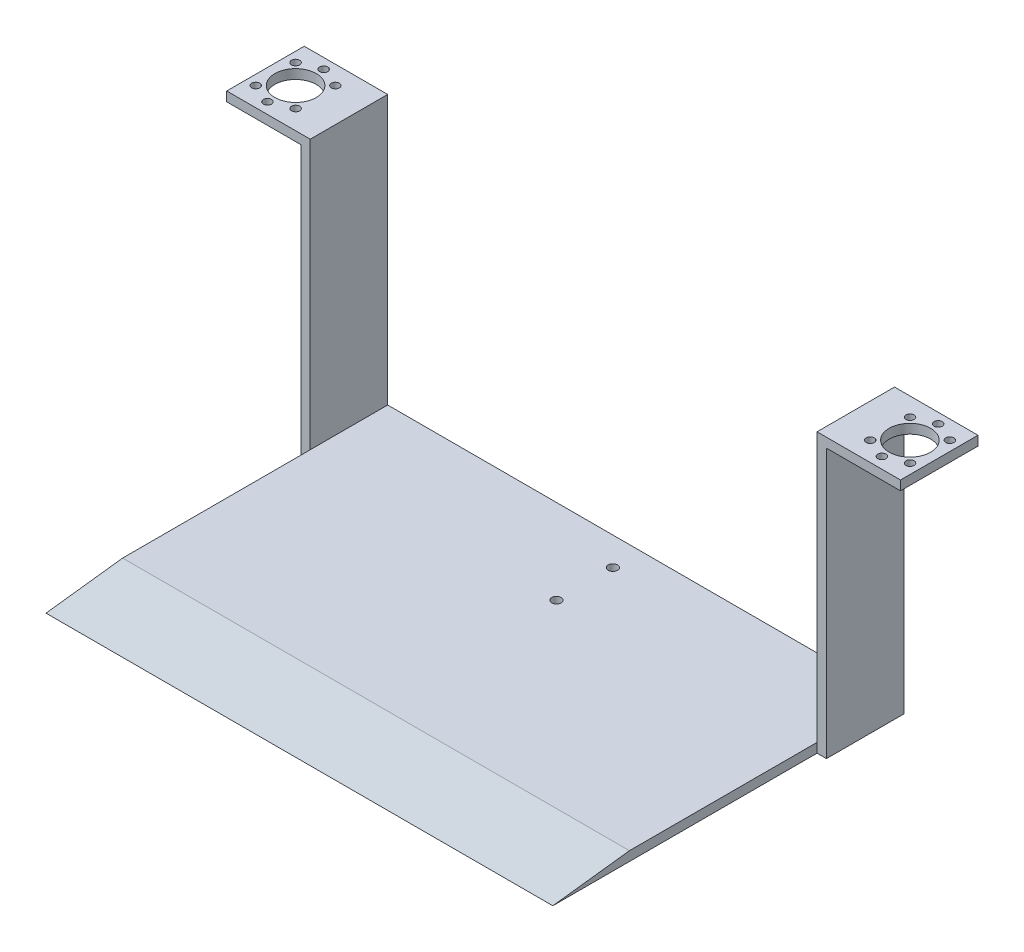
ISO-10303-21;
HEADER;
FILE_DESCRIPTION(('STEP AP214'),'2;1');
FILE_NAME('part.step','',(''),(''),'','','');
FILE_SCHEMA(('AUTOMOTIVE_DESIGN { 1 0 10303 214 1 1 1 1 }'));
ENDSEC;
DATA;
#1=APPLICATION_CONTEXT('core data for automotive mechanical design processes');
#2=APPLICATION_PROTOCOL_DEFINITION('international standard','automotive_design',2000,#1);
#3=PRODUCT_CONTEXT('',#1,'mechanical');
#4=PRODUCT('Part','Part','',(#3));
#5=PRODUCT_RELATED_PRODUCT_CATEGORY('part','',(#4));
#6=PRODUCT_DEFINITION_FORMATION('','',#4);
#7=PRODUCT_DEFINITION_CONTEXT('part definition',#1,'design');
#8=PRODUCT_DEFINITION('design','',#6,#7);
#9=PRODUCT_DEFINITION_SHAPE('','',#8);
#10=(LENGTH_UNIT() NAMED_UNIT(*) SI_UNIT(.MILLI.,.METRE.));
#11=(NAMED_UNIT(*) PLANE_ANGLE_UNIT() SI_UNIT($,.RADIAN.));
#12=(NAMED_UNIT(*) SI_UNIT($,.STERADIAN.) SOLID_ANGLE_UNIT());
#13=UNCERTAINTY_MEASURE_WITH_UNIT(LENGTH_MEASURE(1.E-05),#10,'distance_accuracy_value','');
#14=(GEOMETRIC_REPRESENTATION_CONTEXT(3) GLOBAL_UNCERTAINTY_ASSIGNED_CONTEXT((#13)) GLOBAL_UNIT_ASSIGNED_CONTEXT((#10,
#11,#12)) REPRESENTATION_CONTEXT('',''));
#15=CARTESIAN_POINT('',(0.,0.,0.));
#16=DIRECTION('',(0.,0.,1.));
#17=DIRECTION('',(1.,0.,0.));
#18=AXIS2_PLACEMENT_3D('',#15,#16,#17);
#19=CARTESIAN_POINT('',(0.,187.96,0.));
#20=DIRECTION('',(0.,-1.,0.));
#21=DIRECTION('',(0.,0.,-1.));
#22=AXIS2_PLACEMENT_3D('',#19,#20,#21);
#23=PLANE('',#22);
#24=CARTESIAN_POINT('',(20.0659999999999,187.96,-374.092));
#25=DIRECTION('',(0.,1.,0.));
#26=DIRECTION('',(0.,0.,1.));
#27=AXIS2_PLACEMENT_3D('',#24,#25,#26);
#28=CIRCLE('',#27,2.75);
#29=CARTESIAN_POINT('',(20.0659999999999,187.96,-371.342));
#30=VERTEX_POINT('',#29);
#31=EDGE_CURVE('E231',#30,#30,#28,.T.);
#32=ORIENTED_EDGE('',*,*,#31,.F.);
#33=EDGE_LOOP('',(#32));
#34=FACE_BOUND('',#33,.T.);
#35=CARTESIAN_POINT('',(6.63097115745544,187.96,-341.656971157456));
#36=DIRECTION('',(0.,1.,0.));
#37=DIRECTION('',(0.,0.,1.));
#38=AXIS2_PLACEMENT_3D('',#35,#36,#37);
#39=CIRCLE('',#38,2.75);
#40=CARTESIAN_POINT('',(6.63097115745544,187.96,-338.906971157456));
#41=VERTEX_POINT('',#40);
#42=EDGE_CURVE('E228',#41,#41,#39,.T.);
#43=ORIENTED_EDGE('',*,*,#42,.F.);
#44=EDGE_LOOP('',(#43));
#45=FACE_BOUND('',#44,.T.);
#46=CARTESIAN_POINT('',(20.0659999999999,187.96,-336.092));
#47=DIRECTION('',(0.,1.,0.));
#48=DIRECTION('',(0.,0.,1.));
#49=AXIS2_PLACEMENT_3D('',#46,#47,#48);
#50=CIRCLE('',#49,2.75);
#51=CARTESIAN_POINT('',(20.0659999999999,187.96,-333.342));
#52=VERTEX_POINT('',#51);
#53=EDGE_CURVE('E240',#52,#52,#50,.T.);
#54=ORIENTED_EDGE('',*,*,#53,.F.);
#55=EDGE_LOOP('',(#54));
#56=FACE_BOUND('',#55,.T.);
#57=CARTESIAN_POINT('',(33.5010288425443,187.96,-341.656971157456));
#58=DIRECTION('',(0.,1.,0.));
#59=DIRECTION('',(0.,0.,1.));
#60=AXIS2_PLACEMENT_3D('',#57,#58,#59);
#61=CIRCLE('',#60,2.75);
#62=CARTESIAN_POINT('',(33.5010288425443,187.96,-338.906971157456));
#63=VERTEX_POINT('',#62);
#64=EDGE_CURVE('E248',#63,#63,#61,.T.);
#65=ORIENTED_EDGE('',*,*,#64,.F.);
#66=EDGE_LOOP('',(#65));
#67=FACE_BOUND('',#66,.T.);
#68=CARTESIAN_POINT('',(33.5010288425443,187.96,-368.527028842544));
#69=DIRECTION('',(0.,1.,0.));
#70=DIRECTION('',(0.,0.,1.));
#71=AXIS2_PLACEMENT_3D('',#68,#69,#70);
#72=CIRCLE('',#71,2.75);
#73=CARTESIAN_POINT('',(33.5010288425443,187.96,-365.777028842544));
#74=VERTEX_POINT('',#73);
#75=EDGE_CURVE('E244',#74,#74,#72,.T.);
#76=ORIENTED_EDGE('',*,*,#75,.F.);
#77=EDGE_LOOP('',(#76));
#78=FACE_BOUND('',#77,.T.);
#79=CARTESIAN_POINT('',(6.63097115745544,187.96,-368.527028842544));
#80=DIRECTION('',(0.,1.,0.));
#81=DIRECTION('',(0.,0.,1.));
#82=AXIS2_PLACEMENT_3D('',#79,#80,#81);
#83=CIRCLE('',#82,2.75);
#84=CARTESIAN_POINT('',(6.63097115745544,187.96,-365.777028842544));
#85=VERTEX_POINT('',#84);
#86=EDGE_CURVE('E236',#85,#85,#83,.T.);
#87=ORIENTED_EDGE('',*,*,#86,.F.);
#88=EDGE_LOOP('',(#87));
#89=FACE_BOUND('',#88,.T.);
#90=CARTESIAN_POINT('',(20.0659999999999,187.96,-355.092));
#91=DIRECTION('',(0.,1.,0.));
#92=DIRECTION('',(0.,0.,1.));
#93=AXIS2_PLACEMENT_3D('',#90,#91,#92);
#94=CIRCLE('',#93,14.);
#95=CARTESIAN_POINT('',(20.0659999999999,187.96,-341.092));
#96=VERTEX_POINT('',#95);
#97=EDGE_CURVE('E345',#96,#96,#94,.T.);
#98=ORIENTED_EDGE('',*,*,#97,.F.);
#99=EDGE_LOOP('',(#98));
#100=FACE_BOUND('',#99,.T.);
#101=DIRECTION('',(0.,0.,1.));
#102=VECTOR('',#101,1.);
#103=CARTESIAN_POINT('',(0.,187.96,0.));
#104=LINE('',#103,#102);
#105=CARTESIAN_POINT('',(-1.11022302462516E-13,187.96,-381.));
#106=VERTEX_POINT('',#105);
#107=CARTESIAN_POINT('',(-1.11022302462516E-13,187.96,-328.676));
#108=VERTEX_POINT('',#107);
#109=EDGE_CURVE('E358',#106,#108,#104,.T.);
#110=ORIENTED_EDGE('',*,*,#109,.T.);
#111=DIRECTION('',(-1.,0.,0.));
#112=VECTOR('',#111,1.);
#113=CARTESIAN_POINT('',(56.3626,187.96,-328.676));
#114=LINE('',#113,#112);
#115=CARTESIAN_POINT('',(56.3626,187.96,-328.676));
#116=VERTEX_POINT('',#115);
#117=EDGE_CURVE('E192',#116,#108,#114,.T.);
#118=ORIENTED_EDGE('',*,*,#117,.F.);
#119=DIRECTION('',(0.,0.,1.));
#120=VECTOR('',#119,1.);
#121=CARTESIAN_POINT('',(56.3626,187.96,-381.));
#122=LINE('',#121,#120);
#123=CARTESIAN_POINT('',(56.3626,187.96,-381.));
#124=VERTEX_POINT('',#123);
#125=EDGE_CURVE('E331',#124,#116,#122,.T.);
#126=ORIENTED_EDGE('',*,*,#125,.F.);
#127=DIRECTION('',(-1.,0.,0.));
#128=VECTOR('',#127,1.);
#129=CARTESIAN_POINT('',(-1.11022302462516E-13,187.96,-381.));
#130=LINE('',#129,#128);
#131=EDGE_CURVE('E62',#124,#106,#130,.T.);
#132=ORIENTED_EDGE('',*,*,#131,.T.);
#133=EDGE_LOOP('',(#110,#118,#126,#132));
#134=FACE_BOUND('',#133,.T.);
#135=ADVANCED_FACE('F44',(#34,#45,#56,#67,#78,#89,#100,#134),#23,.F.);
#136=CARTESIAN_POINT('',(0.,187.96,0.));
#137=DIRECTION('',(1.,0.,0.));
#138=DIRECTION('',(0.,0.,-1.));
#139=AXIS2_PLACEMENT_3D('',#136,#137,#138);
#140=PLANE('',#139);
#141=DIRECTION('',(0.,0.,-1.));
#142=VECTOR('',#141,1.);
#143=CARTESIAN_POINT('',(-1.66533453693774E-13,181.597400076,-381.));
#144=LINE('',#143,#142);
#145=CARTESIAN_POINT('',(-1.11022302462516E-13,181.597400076,-328.676));
#146=VERTEX_POINT('',#145);
#147=CARTESIAN_POINT('',(-1.66533453693774E-13,181.597400076,-381.));
#148=VERTEX_POINT('',#147);
#149=EDGE_CURVE('E285',#146,#148,#144,.T.);
#150=ORIENTED_EDGE('',*,*,#149,.F.);
#151=DIRECTION('',(0.,1.,0.));
#152=VECTOR('',#151,1.);
#153=CARTESIAN_POINT('',(-1.11022302462516E-13,0.,-328.676));
#154=LINE('',#153,#152);
#155=EDGE_CURVE('E204',#146,#108,#154,.T.);
#156=ORIENTED_EDGE('',*,*,#155,.T.);
#157=ORIENTED_EDGE('',*,*,#109,.F.);
#158=DIRECTION('',(0.,-1.,0.));
#159=VECTOR('',#158,1.);
#160=CARTESIAN_POINT('',(-1.11022302462516E-13,187.96,-381.));
#161=LINE('',#160,#159);
#162=EDGE_CURVE('E366',#106,#148,#161,.T.);
#163=ORIENTED_EDGE('',*,*,#162,.T.);
#164=EDGE_LOOP('',(#150,#156,#157,#163));
#165=FACE_BOUND('',#164,.T.);
#166=ADVANCED_FACE('F46',(#165),#140,.F.);
#167=CARTESIAN_POINT('',(454.914,187.96,0.));
#168=DIRECTION('',(-1.,0.,0.));
#169=DIRECTION('',(0.,0.,1.));
#170=AXIS2_PLACEMENT_3D('',#167,#168,#169);
#171=PLANE('',#170);
#172=DIRECTION('',(0.,0.,-1.));
#173=VECTOR('',#172,1.);
#174=CARTESIAN_POINT('',(454.914,187.96,0.));
#175=LINE('',#174,#173);
#176=CARTESIAN_POINT('',(454.914,187.96,-328.676));
#177=VERTEX_POINT('',#176);
#178=CARTESIAN_POINT('',(454.914,187.96,-381.));
#179=VERTEX_POINT('',#178);
#180=EDGE_CURVE('E70',#177,#179,#175,.T.);
#181=ORIENTED_EDGE('',*,*,#180,.F.);
#182=DIRECTION('',(0.,1.,0.));
#183=VECTOR('',#182,1.);
#184=CARTESIAN_POINT('',(454.914,0.,-328.676));
#185=LINE('',#184,#183);
#186=CARTESIAN_POINT('',(454.914,181.597400076,-328.676));
#187=VERTEX_POINT('',#186);
#188=EDGE_CURVE('E186',#187,#177,#185,.T.);
#189=ORIENTED_EDGE('',*,*,#188,.F.);
#190=DIRECTION('',(0.,0.,1.));
#191=VECTOR('',#190,1.);
#192=CARTESIAN_POINT('',(454.914,181.597400076,-202.0062));
#193=LINE('',#192,#191);
#194=CARTESIAN_POINT('',(454.914,181.597400076,-381.));
#195=VERTEX_POINT('',#194);
#196=EDGE_CURVE('E305',#195,#187,#193,.T.);
#197=ORIENTED_EDGE('',*,*,#196,.F.);
#198=DIRECTION('',(0.,-1.,0.));
#199=VECTOR('',#198,1.);
#200=CARTESIAN_POINT('',(454.914,187.96,-381.));
#201=LINE('',#200,#199);
#202=EDGE_CURVE('E373',#179,#195,#201,.T.);
#203=ORIENTED_EDGE('',*,*,#202,.F.);
#204=EDGE_LOOP('',(#181,#189,#197,#203));
#205=FACE_BOUND('',#204,.T.);
#206=ADVANCED_FACE('F471',(#205),#171,.F.);
#207=CARTESIAN_POINT('',(-1.11022302462516E-13,187.96,-381.));
#208=DIRECTION('',(0.,0.,1.));
#209=DIRECTION('',(1.,0.,0.));
#210=AXIS2_PLACEMENT_3D('',#207,#208,#209);
#211=PLANE('',#210);
#212=DIRECTION('',(0.,-1.,0.));
#213=VECTOR('',#212,1.);
#214=CARTESIAN_POINT('',(50.0125999999998,0.,-381.));
#215=LINE('',#214,#213);
#216=CARTESIAN_POINT('',(50.0125999999998,181.597400076,-381.));
#217=VERTEX_POINT('',#216);
#218=CARTESIAN_POINT('',(50.0125999999998,0.,-381.));
#219=VERTEX_POINT('',#218);
#220=EDGE_CURVE('E287',#217,#219,#215,.T.);
#221=ORIENTED_EDGE('',*,*,#220,.F.);
#222=DIRECTION('',(-1.,0.,0.));
#223=VECTOR('',#222,1.);
#224=CARTESIAN_POINT('',(50.0125999999998,181.597400076,-381.));
#225=LINE('',#224,#223);
#226=EDGE_CURVE('E294',#217,#148,#225,.T.);
#227=ORIENTED_EDGE('',*,*,#226,.T.);
#228=ORIENTED_EDGE('',*,*,#162,.F.);
#229=ORIENTED_EDGE('',*,*,#131,.F.);
#230=DIRECTION('',(0.,1.,0.));
#231=VECTOR('',#230,1.);
#232=CARTESIAN_POINT('',(56.3626,6.35000000000002,-381.));
#233=LINE('',#232,#231);
#234=CARTESIAN_POINT('',(56.3626,6.35000000000002,-381.));
#235=VERTEX_POINT('',#234);
#236=EDGE_CURVE('E338',#235,#124,#233,.T.);
#237=ORIENTED_EDGE('',*,*,#236,.F.);
#238=DIRECTION('',(-1.,0.,0.));
#239=VECTOR('',#238,1.);
#240=CARTESIAN_POINT('',(56.3626,6.35000000000002,-381.));
#241=LINE('',#240,#239);
#242=CARTESIAN_POINT('',(398.5514,6.35000000000002,-381.));
#243=VERTEX_POINT('',#242);
#244=EDGE_CURVE('E326',#243,#235,#241,.T.);
#245=ORIENTED_EDGE('',*,*,#244,.F.);
#246=DIRECTION('',(0.,1.,0.));
#247=VECTOR('',#246,1.);
#248=CARTESIAN_POINT('',(398.5514,6.35000000000002,-381.));
#249=LINE('',#248,#247);
#250=CARTESIAN_POINT('',(398.5514,187.96,-381.));
#251=VERTEX_POINT('',#250);
#252=EDGE_CURVE('E330',#243,#251,#249,.T.);
#253=ORIENTED_EDGE('',*,*,#252,.T.);
#254=EDGE_CURVE('E363',#179,#251,#130,.T.);
#255=ORIENTED_EDGE('',*,*,#254,.F.);
#256=ORIENTED_EDGE('',*,*,#202,.T.);
#257=DIRECTION('',(1.,0.,0.));
#258=VECTOR('',#257,1.);
#259=CARTESIAN_POINT('',(404.9014,181.597400076,-381.));
#260=LINE('',#259,#258);
#261=CARTESIAN_POINT('',(404.9014,181.597400076,-381.));
#262=VERTEX_POINT('',#261);
#263=EDGE_CURVE('E309',#262,#195,#260,.T.);
#264=ORIENTED_EDGE('',*,*,#263,.F.);
#265=DIRECTION('',(0.,1.,0.));
#266=VECTOR('',#265,1.);
#267=CARTESIAN_POINT('',(404.9014,0.,-381.));
#268=LINE('',#267,#266);
#269=CARTESIAN_POINT('',(404.9014,0.,-381.));
#270=VERTEX_POINT('',#269);
#271=EDGE_CURVE('E301',#270,#262,#268,.T.);
#272=ORIENTED_EDGE('',*,*,#271,.F.);
#273=DIRECTION('',(-1.,0.,0.));
#274=VECTOR('',#273,1.);
#275=CARTESIAN_POINT('',(-1.11022302462516E-13,0.,-381.));
#276=LINE('',#275,#274);
#277=EDGE_CURVE('E355',#270,#219,#276,.T.);
#278=ORIENTED_EDGE('',*,*,#277,.T.);
#279=EDGE_LOOP('',(#221,#227,#228,#229,#237,#245,#253,#255,#256,#264,#272,#278));
#280=FACE_BOUND('',#279,.T.);
#281=ADVANCED_FACE('F461',(#280),#211,.F.);
#282=CARTESIAN_POINT('',(434.848,187.96,-374.174211984588));
#283=DIRECTION('',(0.,1.,0.));
#284=DIRECTION('',(0.,0.,1.));
#285=AXIS2_PLACEMENT_3D('',#282,#283,#284);
#286=CIRCLE('',#285,2.7499945);
#287=CARTESIAN_POINT('',(434.848,187.96,-371.424217484588));
#288=VERTEX_POINT('',#287);
#289=EDGE_CURVE('E255',#288,#288,#286,.T.);
#290=ORIENTED_EDGE('',*,*,#289,.F.);
#291=EDGE_LOOP('',(#290));
#292=FACE_BOUND('',#291,.T.);
#293=CARTESIAN_POINT('',(421.412971157455,187.96,-341.739183142044));
#294=DIRECTION('',(0.,1.,0.));
#295=DIRECTION('',(0.,0.,1.));
#296=AXIS2_PLACEMENT_3D('',#293,#294,#295);
#297=CIRCLE('',#296,2.74999999999998);
#298=CARTESIAN_POINT('',(421.412971157455,187.96,-338.989183142044));
#299=VERTEX_POINT('',#298);
#300=EDGE_CURVE('E261',#299,#299,#297,.T.);
#301=ORIENTED_EDGE('',*,*,#300,.F.);
#302=EDGE_LOOP('',(#301));
#303=FACE_BOUND('',#302,.T.);
#304=CARTESIAN_POINT('',(434.848,187.96,-336.174211984588));
#305=DIRECTION('',(0.,1.,0.));
#306=DIRECTION('',(0.,0.,1.));
#307=AXIS2_PLACEMENT_3D('',#304,#305,#306);
#308=CIRCLE('',#307,2.74999999999998);
#309=CARTESIAN_POINT('',(434.848,187.96,-333.424211984588));
#310=VERTEX_POINT('',#309);
#311=EDGE_CURVE('E265',#310,#310,#308,.T.);
#312=ORIENTED_EDGE('',*,*,#311,.F.);
#313=EDGE_LOOP('',(#312));
#314=FACE_BOUND('',#313,.T.);
#315=CARTESIAN_POINT('',(448.283028842544,187.96,-341.739183142044));
#316=DIRECTION('',(0.,1.,0.));
#317=DIRECTION('',(0.,0.,1.));
#318=AXIS2_PLACEMENT_3D('',#315,#316,#317);
#319=CIRCLE('',#318,2.74999999999991);
#320=CARTESIAN_POINT('',(448.283028842544,187.96,-338.989183142044));
#321=VERTEX_POINT('',#320);
#322=EDGE_CURVE('E274',#321,#321,#319,.T.);
#323=ORIENTED_EDGE('',*,*,#322,.F.);
#324=EDGE_LOOP('',(#323));
#325=FACE_BOUND('',#324,.T.);
#326=CARTESIAN_POINT('',(421.412971157455,187.96,-368.609240827133));
#327=DIRECTION('',(0.,1.,0.));
#328=DIRECTION('',(0.,0.,1.));
#329=AXIS2_PLACEMENT_3D('',#326,#327,#328);
#330=CIRCLE('',#329,2.74999999999998);
#331=CARTESIAN_POINT('',(421.412971157455,187.96,-365.859240827133));
#332=VERTEX_POINT('',#331);
#333=EDGE_CURVE('E270',#332,#332,#330,.T.);
#334=ORIENTED_EDGE('',*,*,#333,.F.);
#335=EDGE_LOOP('',(#334));
#336=FACE_BOUND('',#335,.T.);
#337=CARTESIAN_POINT('',(448.283028842544,187.96,-368.609240827133));
#338=DIRECTION('',(0.,1.,0.));
#339=DIRECTION('',(0.,0.,1.));
#340=AXIS2_PLACEMENT_3D('',#337,#338,#339);
#341=CIRCLE('',#340,2.74999999999998);
#342=CARTESIAN_POINT('',(448.283028842544,187.96,-365.859240827133));
#343=VERTEX_POINT('',#342);
#344=EDGE_CURVE('E260',#343,#343,#341,.T.);
#345=ORIENTED_EDGE('',*,*,#344,.F.);
#346=EDGE_LOOP('',(#345));
#347=FACE_BOUND('',#346,.T.);
#348=CARTESIAN_POINT('',(434.848,187.96,-355.092));
#349=DIRECTION('',(0.,1.,0.));
#350=DIRECTION('',(0.,0.,1.));
#351=AXIS2_PLACEMENT_3D('',#348,#349,#350);
#352=CIRCLE('',#351,14.);
#353=CARTESIAN_POINT('',(434.848,187.96,-341.092));
#354=VERTEX_POINT('',#353);
#355=EDGE_CURVE('E341',#354,#354,#352,.T.);
#356=ORIENTED_EDGE('',*,*,#355,.F.);
#357=EDGE_LOOP('',(#356));
#358=FACE_BOUND('',#357,.T.);
#359=DIRECTION('',(0.,0.,-1.));
#360=VECTOR('',#359,1.);
#361=CARTESIAN_POINT('',(398.5514,187.96,-381.));
#362=LINE('',#361,#360);
#363=CARTESIAN_POINT('',(398.5514,187.96,-328.676));
#364=VERTEX_POINT('',#363);
#365=EDGE_CURVE('E335',#364,#251,#362,.T.);
#366=ORIENTED_EDGE('',*,*,#365,.F.);
#367=DIRECTION('',(-1.,0.,0.));
#368=VECTOR('',#367,1.);
#369=CARTESIAN_POINT('',(398.5514,187.96,-328.676));
#370=LINE('',#369,#368);
#371=EDGE_CURVE('E187',#177,#364,#370,.T.);
#372=ORIENTED_EDGE('',*,*,#371,.F.);
#373=ORIENTED_EDGE('',*,*,#180,.T.);
#374=ORIENTED_EDGE('',*,*,#254,.T.);
#375=EDGE_LOOP('',(#366,#372,#373,#374));
#376=FACE_BOUND('',#375,.T.);
#377=ADVANCED_FACE('F449',(#292,#303,#314,#325,#336,#347,#358,#376),#23,.F.);
#378=CARTESIAN_POINT('',(0.,0.,0.));
#379=DIRECTION('',(0.,-1.,0.));
#380=DIRECTION('',(0.,0.,-1.));
#381=AXIS2_PLACEMENT_3D('',#378,#379,#380);
#382=PLANE('',#381);
#383=CARTESIAN_POINT('',(227.457,0.,-361.95));
#384=DIRECTION('',(0.,-1.,0.));
#385=DIRECTION('',(0.,0.,-1.));
#386=AXIS2_PLACEMENT_3D('',#383,#384,#385);
#387=CIRCLE('',#386,3.17499999999997);
#388=CARTESIAN_POINT('',(227.457,0.,-365.125));
#389=VERTEX_POINT('',#388);
#390=EDGE_CURVE('E432',#389,#389,#387,.T.);
#391=ORIENTED_EDGE('',*,*,#390,.F.);
#392=EDGE_LOOP('',(#391));
#393=FACE_BOUND('',#392,.T.);
#394=CARTESIAN_POINT('',(227.457,0.,-323.85));
#395=DIRECTION('',(0.,-1.,0.));
#396=DIRECTION('',(0.,0.,-1.));
#397=AXIS2_PLACEMENT_3D('',#394,#395,#396);
#398=CIRCLE('',#397,3.17499999999997);
#399=CARTESIAN_POINT('',(227.457,0.,-327.025));
#400=VERTEX_POINT('',#399);
#401=EDGE_CURVE('E195',#400,#400,#398,.T.);
#402=ORIENTED_EDGE('',*,*,#401,.F.);
#403=EDGE_LOOP('',(#402));
#404=FACE_BOUND('',#403,.T.);
#405=DIRECTION('',(-1.,0.,0.));
#406=VECTOR('',#405,1.);
#407=CARTESIAN_POINT('',(398.5514,0.,-328.676));
#408=LINE('',#407,#406);
#409=CARTESIAN_POINT('',(404.9014,0.,-328.676));
#410=VERTEX_POINT('',#409);
#411=CARTESIAN_POINT('',(398.5514,0.,-328.676));
#412=VERTEX_POINT('',#411);
#413=EDGE_CURVE('E174',#410,#412,#408,.T.);
#414=ORIENTED_EDGE('',*,*,#413,.T.);
#415=DIRECTION('',(0.,0.,-1.));
#416=VECTOR('',#415,1.);
#417=CARTESIAN_POINT('',(398.5514,0.,-202.0062));
#418=LINE('',#417,#416);
#419=CARTESIAN_POINT('',(398.5514,0.,-150.289600182359));
#420=VERTEX_POINT('',#419);
#421=EDGE_CURVE('E159',#420,#412,#418,.T.);
#422=ORIENTED_EDGE('',*,*,#421,.F.);
#423=DIRECTION('',(1.,0.,0.));
#424=VECTOR('',#423,1.);
#425=CARTESIAN_POINT('',(4.25761754440301,0.,-150.289600182359));
#426=LINE('',#425,#424);
#427=CARTESIAN_POINT('',(56.3626,0.,-150.289600182359));
#428=VERTEX_POINT('',#427);
#429=EDGE_CURVE('E224',#428,#420,#426,.T.);
#430=ORIENTED_EDGE('',*,*,#429,.F.);
#431=DIRECTION('',(0.,0.,-1.));
#432=VECTOR('',#431,1.);
#433=CARTESIAN_POINT('',(56.3626,0.,-202.0062));
#434=LINE('',#433,#432);
#435=CARTESIAN_POINT('',(56.3626,0.,-328.676));
#436=VERTEX_POINT('',#435);
#437=EDGE_CURVE('E225',#428,#436,#434,.T.);
#438=ORIENTED_EDGE('',*,*,#437,.T.);
#439=DIRECTION('',(-1.,0.,0.));
#440=VECTOR('',#439,1.);
#441=CARTESIAN_POINT('',(56.3626,0.,-328.676));
#442=LINE('',#441,#440);
#443=CARTESIAN_POINT('',(50.0126,0.,-328.676));
#444=VERTEX_POINT('',#443);
#445=EDGE_CURVE('E202',#436,#444,#442,.T.);
#446=ORIENTED_EDGE('',*,*,#445,.T.);
#447=DIRECTION('',(0.,0.,-1.));
#448=VECTOR('',#447,1.);
#449=CARTESIAN_POINT('',(50.0126,0.,0.));
#450=LINE('',#449,#448);
#451=EDGE_CURVE('E349',#444,#219,#450,.T.);
#452=ORIENTED_EDGE('',*,*,#451,.T.);
#453=ORIENTED_EDGE('',*,*,#277,.F.);
#454=DIRECTION('',(0.,0.,1.));
#455=VECTOR('',#454,1.);
#456=CARTESIAN_POINT('',(404.9014,0.,0.));
#457=LINE('',#456,#455);
#458=EDGE_CURVE('E184',#270,#410,#457,.T.);
#459=ORIENTED_EDGE('',*,*,#458,.T.);
#460=EDGE_LOOP('',(#414,#422,#430,#438,#446,#452,#453,#459));
#461=FACE_BOUND('',#460,.T.);
#462=ADVANCED_FACE('F182',(#393,#404,#461),#382,.T.);
#463=CARTESIAN_POINT('',(50.0126,0.,0.));
#464=DIRECTION('',(1.,0.,0.));
#465=DIRECTION('',(0.,0.,-1.));
#466=AXIS2_PLACEMENT_3D('',#463,#464,#465);
#467=PLANE('',#466);
#468=ORIENTED_EDGE('',*,*,#451,.F.);
#469=DIRECTION('',(0.,1.,0.));
#470=VECTOR('',#469,1.);
#471=CARTESIAN_POINT('',(50.0126,0.,-328.676));
#472=LINE('',#471,#470);
#473=CARTESIAN_POINT('',(50.0125999999999,181.597400076,-328.676));
#474=VERTEX_POINT('',#473);
#475=EDGE_CURVE('E179',#444,#474,#472,.T.);
#476=ORIENTED_EDGE('',*,*,#475,.T.);
#477=DIRECTION('',(0.,0.,-1.));
#478=VECTOR('',#477,1.);
#479=CARTESIAN_POINT('',(50.0125999999998,181.597400076,-381.));
#480=LINE('',#479,#478);
#481=EDGE_CURVE('E291',#474,#217,#480,.T.);
#482=ORIENTED_EDGE('',*,*,#481,.T.);
#483=ORIENTED_EDGE('',*,*,#220,.T.);
#484=EDGE_LOOP('',(#468,#476,#482,#483));
#485=FACE_BOUND('',#484,.T.);
#486=ADVANCED_FACE('F448',(#485),#467,.F.);
#487=CARTESIAN_POINT('',(404.9014,0.,0.));
#488=DIRECTION('',(-1.,0.,0.));
#489=DIRECTION('',(0.,0.,1.));
#490=AXIS2_PLACEMENT_3D('',#487,#488,#489);
#491=PLANE('',#490);
#492=DIRECTION('',(0.,0.,1.));
#493=VECTOR('',#492,1.);
#494=CARTESIAN_POINT('',(404.9014,181.597400076,-202.0062));
#495=LINE('',#494,#493);
#496=CARTESIAN_POINT('',(404.9014,181.597400076,-328.676));
#497=VERTEX_POINT('',#496);
#498=EDGE_CURVE('E304',#262,#497,#495,.T.);
#499=ORIENTED_EDGE('',*,*,#498,.T.);
#500=DIRECTION('',(0.,-1.,0.));
#501=VECTOR('',#500,1.);
#502=CARTESIAN_POINT('',(404.9014,0.,-328.676));
#503=LINE('',#502,#501);
#504=EDGE_CURVE('E216',#497,#410,#503,.T.);
#505=ORIENTED_EDGE('',*,*,#504,.T.);
#506=ORIENTED_EDGE('',*,*,#458,.F.);
#507=ORIENTED_EDGE('',*,*,#271,.T.);
#508=EDGE_LOOP('',(#499,#505,#506,#507));
#509=FACE_BOUND('',#508,.T.);
#510=ADVANCED_FACE('F457',(#509),#491,.F.);
#511=CARTESIAN_POINT('',(434.848,0.,-355.092));
#512=DIRECTION('',(0.,1.,0.));
#513=DIRECTION('',(0.,0.,1.));
#514=AXIS2_PLACEMENT_3D('',#511,#512,#513);
#515=CYLINDRICAL_SURFACE('',#514,14.);
#516=CARTESIAN_POINT('',(434.848,181.597400076,-355.092));
#517=DIRECTION('',(0.,1.,0.));
#518=DIRECTION('',(0.,0.,1.));
#519=AXIS2_PLACEMENT_3D('',#516,#517,#518);
#520=CIRCLE('',#519,14.);
#521=CARTESIAN_POINT('',(434.848,181.597400076,-341.092));
#522=VERTEX_POINT('',#521);
#523=EDGE_CURVE('E315',#522,#522,#520,.F.);
#524=ORIENTED_EDGE('',*,*,#523,.T.);
#525=EDGE_LOOP('',(#524));
#526=FACE_BOUND('',#525,.T.);
#527=ORIENTED_EDGE('',*,*,#355,.T.);
#528=EDGE_LOOP('',(#527));
#529=FACE_BOUND('',#528,.T.);
#530=ADVANCED_FACE('F478',(#526,#529),#515,.F.);
#531=CARTESIAN_POINT('',(20.0659999999999,0.,-355.092));
#532=DIRECTION('',(0.,1.,0.));
#533=DIRECTION('',(0.,0.,1.));
#534=AXIS2_PLACEMENT_3D('',#531,#532,#533);
#535=CYLINDRICAL_SURFACE('',#534,14.);
#536=CARTESIAN_POINT('',(20.0659999999999,181.597400076,-355.092));
#537=DIRECTION('',(0.,1.,0.));
#538=DIRECTION('',(0.,0.,1.));
#539=AXIS2_PLACEMENT_3D('',#536,#537,#538);
#540=CIRCLE('',#539,14.);
#541=CARTESIAN_POINT('',(20.0659999999999,181.597400076,-341.092));
#542=VERTEX_POINT('',#541);
#543=EDGE_CURVE('E300',#542,#542,#540,.F.);
#544=ORIENTED_EDGE('',*,*,#543,.T.);
#545=EDGE_LOOP('',(#544));
#546=FACE_BOUND('',#545,.T.);
#547=ORIENTED_EDGE('',*,*,#97,.T.);
#548=EDGE_LOOP('',(#547));
#549=FACE_BOUND('',#548,.T.);
#550=ADVANCED_FACE('F482',(#546,#549),#535,.F.);
#551=CARTESIAN_POINT('',(56.3626,6.35000000000002,-381.));
#552=DIRECTION('',(-1.,0.,0.));
#553=DIRECTION('',(0.,0.,1.));
#554=AXIS2_PLACEMENT_3D('',#551,#552,#553);
#555=PLANE('',#554);
#556=ORIENTED_EDGE('',*,*,#125,.T.);
#557=DIRECTION('',(0.,1.,0.));
#558=VECTOR('',#557,1.);
#559=CARTESIAN_POINT('',(56.3626,0.,-328.676));
#560=LINE('',#559,#558);
#561=CARTESIAN_POINT('',(56.3626,6.35000000000002,-328.676));
#562=VERTEX_POINT('',#561);
#563=EDGE_CURVE('E203',#562,#116,#560,.T.);
#564=ORIENTED_EDGE('',*,*,#563,.F.);
#565=DIRECTION('',(0.,0.,1.));
#566=VECTOR('',#565,1.);
#567=CARTESIAN_POINT('',(56.3626,6.35000000000002,-381.));
#568=LINE('',#567,#566);
#569=EDGE_CURVE('E316',#235,#562,#568,.T.);
#570=ORIENTED_EDGE('',*,*,#569,.F.);
#571=ORIENTED_EDGE('',*,*,#236,.T.);
#572=EDGE_LOOP('',(#556,#564,#570,#571));
#573=FACE_BOUND('',#572,.T.);
#574=ADVANCED_FACE('F486',(#573),#555,.F.);
#575=CARTESIAN_POINT('',(398.5514,6.35000000000002,-381.));
#576=DIRECTION('',(1.,0.,0.));
#577=DIRECTION('',(0.,0.,-1.));
#578=AXIS2_PLACEMENT_3D('',#575,#576,#577);
#579=PLANE('',#578);
#580=DIRECTION('',(0.,0.,-1.));
#581=VECTOR('',#580,1.);
#582=CARTESIAN_POINT('',(398.5514,6.35000000000002,-381.));
#583=LINE('',#582,#581);
#584=CARTESIAN_POINT('',(398.5514,6.35000000000002,-328.676));
#585=VERTEX_POINT('',#584);
#586=EDGE_CURVE('E320',#585,#243,#583,.T.);
#587=ORIENTED_EDGE('',*,*,#586,.F.);
#588=DIRECTION('',(0.,1.,0.));
#589=VECTOR('',#588,1.);
#590=CARTESIAN_POINT('',(398.5514,0.,-328.676));
#591=LINE('',#590,#589);
#592=EDGE_CURVE('E177',#585,#364,#591,.T.);
#593=ORIENTED_EDGE('',*,*,#592,.T.);
#594=ORIENTED_EDGE('',*,*,#365,.T.);
#595=ORIENTED_EDGE('',*,*,#252,.F.);
#596=EDGE_LOOP('',(#587,#593,#594,#595));
#597=FACE_BOUND('',#596,.T.);
#598=ADVANCED_FACE('F490',(#597),#579,.F.);
#599=CARTESIAN_POINT('',(0.,6.35000000000002,0.));
#600=DIRECTION('',(0.,1.,0.));
#601=DIRECTION('',(0.,0.,1.));
#602=AXIS2_PLACEMENT_3D('',#599,#600,#601);
#603=PLANE('',#602);
#604=CARTESIAN_POINT('',(227.457,6.35000000000002,-361.95));
#605=DIRECTION('',(0.,1.,0.));
#606=DIRECTION('',(0.,0.,1.));
#607=AXIS2_PLACEMENT_3D('',#604,#605,#606);
#608=CIRCLE('',#607,3.17499999999997);
#609=CARTESIAN_POINT('',(227.457,6.35000000000002,-358.775));
#610=VERTEX_POINT('',#609);
#611=EDGE_CURVE('E48',#610,#610,#608,.T.);
#612=ORIENTED_EDGE('',*,*,#611,.F.);
#613=EDGE_LOOP('',(#612));
#614=FACE_BOUND('',#613,.T.);
#615=CARTESIAN_POINT('',(227.457,6.35000000000002,-323.85));
#616=DIRECTION('',(0.,1.,0.));
#617=DIRECTION('',(0.,0.,1.));
#618=AXIS2_PLACEMENT_3D('',#615,#616,#617);
#619=CIRCLE('',#618,3.17499999999997);
#620=CARTESIAN_POINT('',(227.457,6.35000000000002,-320.675));
#621=VERTEX_POINT('',#620);
#622=EDGE_CURVE('E429',#621,#621,#619,.T.);
#623=ORIENTED_EDGE('',*,*,#622,.F.);
#624=EDGE_LOOP('',(#623));
#625=FACE_BOUND('',#624,.T.);
#626=DIRECTION('',(-1.,0.,0.));
#627=VECTOR('',#626,1.);
#628=CARTESIAN_POINT('',(0.,6.35000000000002,-202.0062));
#629=LINE('',#628,#627);
#630=CARTESIAN_POINT('',(398.5514,6.35,-202.0062));
#631=VERTEX_POINT('',#630);
#632=CARTESIAN_POINT('',(56.3626,6.35000000000001,-202.0062));
#633=VERTEX_POINT('',#632);
#634=EDGE_CURVE('E281',#631,#633,#629,.T.);
#635=ORIENTED_EDGE('',*,*,#634,.F.);
#636=EDGE_CURVE('E322',#631,#585,#583,.T.);
#637=ORIENTED_EDGE('',*,*,#636,.T.);
#638=ORIENTED_EDGE('',*,*,#586,.T.);
#639=ORIENTED_EDGE('',*,*,#244,.T.);
#640=ORIENTED_EDGE('',*,*,#569,.T.);
#641=EDGE_CURVE('E321',#562,#633,#568,.T.);
#642=ORIENTED_EDGE('',*,*,#641,.T.);
#643=EDGE_LOOP('',(#635,#637,#638,#639,#640,#642));
#644=FACE_BOUND('',#643,.T.);
#645=ADVANCED_FACE('F494',(#614,#625,#644),#603,.T.);
#646=CARTESIAN_POINT('',(404.9014,181.597400076,-202.0062));
#647=DIRECTION('',(0.,1.,0.));
#648=DIRECTION('',(0.,0.,1.));
#649=AXIS2_PLACEMENT_3D('',#646,#647,#648);
#650=PLANE('',#649);
#651=CARTESIAN_POINT('',(434.848,181.597400076,-374.174211984588));
#652=DIRECTION('',(0.,1.,0.));
#653=DIRECTION('',(0.,0.,1.));
#654=AXIS2_PLACEMENT_3D('',#651,#652,#653);
#655=CIRCLE('',#654,2.7499945);
#656=CARTESIAN_POINT('',(434.848,181.597400076,-371.424217484588));
#657=VERTEX_POINT('',#656);
#658=EDGE_CURVE('E286',#657,#657,#655,.T.);
#659=ORIENTED_EDGE('',*,*,#658,.T.);
#660=EDGE_LOOP('',(#659));
#661=FACE_BOUND('',#660,.T.);
#662=CARTESIAN_POINT('',(421.412971157455,181.597400076,-341.739183142044));
#663=DIRECTION('',(0.,1.,0.));
#664=DIRECTION('',(0.,0.,1.));
#665=AXIS2_PLACEMENT_3D('',#662,#663,#664);
#666=CIRCLE('',#665,2.74999999999998);
#667=CARTESIAN_POINT('',(421.412971157455,181.597400076,-338.989183142044));
#668=VERTEX_POINT('',#667);
#669=EDGE_CURVE('E398',#668,#668,#666,.T.);
#670=ORIENTED_EDGE('',*,*,#669,.T.);
#671=EDGE_LOOP('',(#670));
#672=FACE_BOUND('',#671,.T.);
#673=CARTESIAN_POINT('',(434.848,181.597400076,-336.174211984588));
#674=DIRECTION('',(0.,1.,0.));
#675=DIRECTION('',(0.,0.,1.));
#676=AXIS2_PLACEMENT_3D('',#673,#674,#675);
#677=CIRCLE('',#676,2.74999999999998);
#678=CARTESIAN_POINT('',(434.848,181.597400076,-333.424211984588));
#679=VERTEX_POINT('',#678);
#680=EDGE_CURVE('E394',#679,#679,#677,.T.);
#681=ORIENTED_EDGE('',*,*,#680,.T.);
#682=EDGE_LOOP('',(#681));
#683=FACE_BOUND('',#682,.T.);
#684=CARTESIAN_POINT('',(448.283028842544,181.597400076,-341.739183142044));
#685=DIRECTION('',(0.,1.,0.));
#686=DIRECTION('',(0.,0.,1.));
#687=AXIS2_PLACEMENT_3D('',#684,#685,#686);
#688=CIRCLE('',#687,2.74999999999991);
#689=CARTESIAN_POINT('',(448.283028842544,181.597400076,-338.989183142044));
#690=VERTEX_POINT('',#689);
#691=EDGE_CURVE('E390',#690,#690,#688,.T.);
#692=ORIENTED_EDGE('',*,*,#691,.T.);
#693=EDGE_LOOP('',(#692));
#694=FACE_BOUND('',#693,.T.);
#695=CARTESIAN_POINT('',(421.412971157455,181.597400076,-368.609240827133));
#696=DIRECTION('',(0.,1.,0.));
#697=DIRECTION('',(0.,0.,1.));
#698=AXIS2_PLACEMENT_3D('',#695,#696,#697);
#699=CIRCLE('',#698,2.74999999999998);
#700=CARTESIAN_POINT('',(421.412971157455,181.597400076,-365.859240827133));
#701=VERTEX_POINT('',#700);
#702=EDGE_CURVE('E386',#701,#701,#699,.T.);
#703=ORIENTED_EDGE('',*,*,#702,.T.);
#704=EDGE_LOOP('',(#703));
#705=FACE_BOUND('',#704,.T.);
#706=CARTESIAN_POINT('',(448.283028842544,181.597400076,-368.609240827133));
#707=DIRECTION('',(0.,1.,0.));
#708=DIRECTION('',(0.,0.,1.));
#709=AXIS2_PLACEMENT_3D('',#706,#707,#708);
#710=CIRCLE('',#709,2.74999999999998);
#711=CARTESIAN_POINT('',(448.283028842544,181.597400076,-365.859240827133));
#712=VERTEX_POINT('',#711);
#713=EDGE_CURVE('E259',#712,#712,#710,.T.);
#714=ORIENTED_EDGE('',*,*,#713,.T.);
#715=EDGE_LOOP('',(#714));
#716=FACE_BOUND('',#715,.T.);
#717=ORIENTED_EDGE('',*,*,#196,.T.);
#718=DIRECTION('',(-1.,0.,0.));
#719=VECTOR('',#718,1.);
#720=CARTESIAN_POINT('',(404.9014,181.597400076,-328.676));
#721=LINE('',#720,#719);
#722=EDGE_CURVE('E11',#187,#497,#721,.T.);
#723=ORIENTED_EDGE('',*,*,#722,.T.);
#724=ORIENTED_EDGE('',*,*,#498,.F.);
#725=ORIENTED_EDGE('',*,*,#263,.T.);
#726=EDGE_LOOP('',(#717,#723,#724,#725));
#727=FACE_BOUND('',#726,.T.);
#728=ORIENTED_EDGE('',*,*,#523,.F.);
#729=EDGE_LOOP('',(#728));
#730=FACE_BOUND('',#729,.T.);
#731=ADVANCED_FACE('F497',(#661,#672,#683,#694,#705,#716,#727,#730),#650,.F.);
#732=CARTESIAN_POINT('',(50.0125999999998,181.597400076,-381.));
#733=DIRECTION('',(0.,1.,0.));
#734=DIRECTION('',(0.,0.,1.));
#735=AXIS2_PLACEMENT_3D('',#732,#733,#734);
#736=PLANE('',#735);
#737=CARTESIAN_POINT('',(20.0659999999999,181.597400076,-374.092));
#738=DIRECTION('',(0.,1.,0.));
#739=DIRECTION('',(0.,0.,1.));
#740=AXIS2_PLACEMENT_3D('',#737,#738,#739);
#741=CIRCLE('',#740,2.75);
#742=CARTESIAN_POINT('',(20.0659999999999,181.597400076,-371.342));
#743=VERTEX_POINT('',#742);
#744=EDGE_CURVE('E266',#743,#743,#741,.T.);
#745=ORIENTED_EDGE('',*,*,#744,.T.);
#746=EDGE_LOOP('',(#745));
#747=FACE_BOUND('',#746,.T.);
#748=CARTESIAN_POINT('',(6.63097115745544,181.597400076,-341.656971157456));
#749=DIRECTION('',(0.,1.,0.));
#750=DIRECTION('',(0.,0.,1.));
#751=AXIS2_PLACEMENT_3D('',#748,#749,#750);
#752=CIRCLE('',#751,2.75);
#753=CARTESIAN_POINT('',(6.63097115745544,181.597400076,-338.906971157456));
#754=VERTEX_POINT('',#753);
#755=EDGE_CURVE('E420',#754,#754,#752,.T.);
#756=ORIENTED_EDGE('',*,*,#755,.T.);
#757=EDGE_LOOP('',(#756));
#758=FACE_BOUND('',#757,.T.);
#759=CARTESIAN_POINT('',(20.0659999999999,181.597400076,-336.092));
#760=DIRECTION('',(0.,1.,0.));
#761=DIRECTION('',(0.,0.,1.));
#762=AXIS2_PLACEMENT_3D('',#759,#760,#761);
#763=CIRCLE('',#762,2.75);
#764=CARTESIAN_POINT('',(20.0659999999999,181.597400076,-333.342));
#765=VERTEX_POINT('',#764);
#766=EDGE_CURVE('E416',#765,#765,#763,.T.);
#767=ORIENTED_EDGE('',*,*,#766,.T.);
#768=EDGE_LOOP('',(#767));
#769=FACE_BOUND('',#768,.T.);
#770=CARTESIAN_POINT('',(33.5010288425443,181.597400076,-341.656971157456));
#771=DIRECTION('',(0.,1.,0.));
#772=DIRECTION('',(0.,0.,1.));
#773=AXIS2_PLACEMENT_3D('',#770,#771,#772);
#774=CIRCLE('',#773,2.75);
#775=CARTESIAN_POINT('',(33.5010288425443,181.597400076,-338.906971157456));
#776=VERTEX_POINT('',#775);
#777=EDGE_CURVE('E412',#776,#776,#774,.T.);
#778=ORIENTED_EDGE('',*,*,#777,.T.);
#779=EDGE_LOOP('',(#778));
#780=FACE_BOUND('',#779,.T.);
#781=CARTESIAN_POINT('',(33.5010288425443,181.597400076,-368.527028842544));
#782=DIRECTION('',(0.,1.,0.));
#783=DIRECTION('',(0.,0.,1.));
#784=AXIS2_PLACEMENT_3D('',#781,#782,#783);
#785=CIRCLE('',#784,2.75);
#786=CARTESIAN_POINT('',(33.5010288425443,181.597400076,-365.777028842544));
#787=VERTEX_POINT('',#786);
#788=EDGE_CURVE('E408',#787,#787,#785,.T.);
#789=ORIENTED_EDGE('',*,*,#788,.T.);
#790=EDGE_LOOP('',(#789));
#791=FACE_BOUND('',#790,.T.);
#792=CARTESIAN_POINT('',(6.63097115745544,181.597400076,-368.527028842544));
#793=DIRECTION('',(0.,1.,0.));
#794=DIRECTION('',(0.,0.,1.));
#795=AXIS2_PLACEMENT_3D('',#792,#793,#794);
#796=CIRCLE('',#795,2.75);
#797=CARTESIAN_POINT('',(6.63097115745544,181.597400076,-365.777028842544));
#798=VERTEX_POINT('',#797);
#799=EDGE_CURVE('E235',#798,#798,#796,.T.);
#800=ORIENTED_EDGE('',*,*,#799,.T.);
#801=EDGE_LOOP('',(#800));
#802=FACE_BOUND('',#801,.T.);
#803=ORIENTED_EDGE('',*,*,#481,.F.);
#804=DIRECTION('',(-1.,0.,0.));
#805=VECTOR('',#804,1.);
#806=CARTESIAN_POINT('',(50.0125999999998,181.597400076,-328.676));
#807=LINE('',#806,#805);
#808=EDGE_CURVE('E54',#474,#146,#807,.T.);
#809=ORIENTED_EDGE('',*,*,#808,.T.);
#810=ORIENTED_EDGE('',*,*,#149,.T.);
#811=ORIENTED_EDGE('',*,*,#226,.F.);
#812=EDGE_LOOP('',(#803,#809,#810,#811));
#813=FACE_BOUND('',#812,.T.);
#814=ORIENTED_EDGE('',*,*,#543,.F.);
#815=EDGE_LOOP('',(#814));
#816=FACE_BOUND('',#815,.T.);
#817=ADVANCED_FACE('F501',(#747,#758,#769,#780,#791,#802,#813,#816),#736,.F.);
#818=CARTESIAN_POINT('',(448.283028842544,0.,-368.609240827133));
#819=DIRECTION('',(0.,1.,0.));
#820=DIRECTION('',(0.,0.,1.));
#821=AXIS2_PLACEMENT_3D('',#818,#819,#820);
#822=CYLINDRICAL_SURFACE('',#821,2.74999999999998);
#823=ORIENTED_EDGE('',*,*,#344,.T.);
#824=EDGE_LOOP('',(#823));
#825=FACE_BOUND('',#824,.T.);
#826=ORIENTED_EDGE('',*,*,#713,.F.);
#827=EDGE_LOOP('',(#826));
#828=FACE_BOUND('',#827,.T.);
#829=ADVANCED_FACE('F505',(#825,#828),#822,.F.);
#830=CARTESIAN_POINT('',(421.412971157455,0.,-368.609240827133));
#831=DIRECTION('',(0.,1.,0.));
#832=DIRECTION('',(0.,0.,1.));
#833=AXIS2_PLACEMENT_3D('',#830,#831,#832);
#834=CYLINDRICAL_SURFACE('',#833,2.74999999999998);
#835=ORIENTED_EDGE('',*,*,#333,.T.);
#836=EDGE_LOOP('',(#835));
#837=FACE_BOUND('',#836,.T.);
#838=ORIENTED_EDGE('',*,*,#702,.F.);
#839=EDGE_LOOP('',(#838));
#840=FACE_BOUND('',#839,.T.);
#841=ADVANCED_FACE('F515',(#837,#840),#834,.F.);
#842=CARTESIAN_POINT('',(448.283028842544,0.,-341.739183142044));
#843=DIRECTION('',(0.,1.,0.));
#844=DIRECTION('',(0.,0.,1.));
#845=AXIS2_PLACEMENT_3D('',#842,#843,#844);
#846=CYLINDRICAL_SURFACE('',#845,2.74999999999991);
#847=ORIENTED_EDGE('',*,*,#322,.T.);
#848=EDGE_LOOP('',(#847));
#849=FACE_BOUND('',#848,.T.);
#850=ORIENTED_EDGE('',*,*,#691,.F.);
#851=EDGE_LOOP('',(#850));
#852=FACE_BOUND('',#851,.T.);
#853=ADVANCED_FACE('F511',(#849,#852),#846,.F.);
#854=CARTESIAN_POINT('',(434.848,0.,-336.174211984588));
#855=DIRECTION('',(0.,1.,0.));
#856=DIRECTION('',(0.,0.,1.));
#857=AXIS2_PLACEMENT_3D('',#854,#855,#856);
#858=CYLINDRICAL_SURFACE('',#857,2.74999999999998);
#859=ORIENTED_EDGE('',*,*,#311,.T.);
#860=EDGE_LOOP('',(#859));
#861=FACE_BOUND('',#860,.T.);
#862=ORIENTED_EDGE('',*,*,#680,.F.);
#863=EDGE_LOOP('',(#862));
#864=FACE_BOUND('',#863,.T.);
#865=ADVANCED_FACE('F507',(#861,#864),#858,.F.);
#866=CARTESIAN_POINT('',(421.412971157455,0.,-341.739183142044));
#867=DIRECTION('',(0.,1.,0.));
#868=DIRECTION('',(0.,0.,1.));
#869=AXIS2_PLACEMENT_3D('',#866,#867,#868);
#870=CYLINDRICAL_SURFACE('',#869,2.74999999999998);
#871=ORIENTED_EDGE('',*,*,#300,.T.);
#872=EDGE_LOOP('',(#871));
#873=FACE_BOUND('',#872,.T.);
#874=ORIENTED_EDGE('',*,*,#669,.F.);
#875=EDGE_LOOP('',(#874));
#876=FACE_BOUND('',#875,.T.);
#877=ADVANCED_FACE('F510',(#873,#876),#870,.F.);
#878=CARTESIAN_POINT('',(434.848,0.,-374.174211984588));
#879=DIRECTION('',(0.,1.,0.));
#880=DIRECTION('',(0.,0.,1.));
#881=AXIS2_PLACEMENT_3D('',#878,#879,#880);
#882=CYLINDRICAL_SURFACE('',#881,2.7499945);
#883=ORIENTED_EDGE('',*,*,#289,.T.);
#884=EDGE_LOOP('',(#883));
#885=FACE_BOUND('',#884,.T.);
#886=ORIENTED_EDGE('',*,*,#658,.F.);
#887=EDGE_LOOP('',(#886));
#888=FACE_BOUND('',#887,.T.);
#889=ADVANCED_FACE('F525',(#885,#888),#882,.F.);
#890=CARTESIAN_POINT('',(6.63097115745544,0.,-368.527028842544));
#891=DIRECTION('',(0.,1.,0.));
#892=DIRECTION('',(0.,0.,1.));
#893=AXIS2_PLACEMENT_3D('',#890,#891,#892);
#894=CYLINDRICAL_SURFACE('',#893,2.75);
#895=ORIENTED_EDGE('',*,*,#86,.T.);
#896=EDGE_LOOP('',(#895));
#897=FACE_BOUND('',#896,.T.);
#898=ORIENTED_EDGE('',*,*,#799,.F.);
#899=EDGE_LOOP('',(#898));
#900=FACE_BOUND('',#899,.T.);
#901=ADVANCED_FACE('F529',(#897,#900),#894,.F.);
#902=CARTESIAN_POINT('',(33.5010288425443,0.,-368.527028842544));
#903=DIRECTION('',(0.,1.,0.));
#904=DIRECTION('',(0.,0.,1.));
#905=AXIS2_PLACEMENT_3D('',#902,#903,#904);
#906=CYLINDRICAL_SURFACE('',#905,2.75);
#907=ORIENTED_EDGE('',*,*,#75,.T.);
#908=EDGE_LOOP('',(#907));
#909=FACE_BOUND('',#908,.T.);
#910=ORIENTED_EDGE('',*,*,#788,.F.);
#911=EDGE_LOOP('',(#910));
#912=FACE_BOUND('',#911,.T.);
#913=ADVANCED_FACE('F539',(#909,#912),#906,.F.);
#914=CARTESIAN_POINT('',(33.5010288425443,0.,-341.656971157456));
#915=DIRECTION('',(0.,1.,0.));
#916=DIRECTION('',(0.,0.,1.));
#917=AXIS2_PLACEMENT_3D('',#914,#915,#916);
#918=CYLINDRICAL_SURFACE('',#917,2.75);
#919=ORIENTED_EDGE('',*,*,#64,.T.);
#920=EDGE_LOOP('',(#919));
#921=FACE_BOUND('',#920,.T.);
#922=ORIENTED_EDGE('',*,*,#777,.F.);
#923=EDGE_LOOP('',(#922));
#924=FACE_BOUND('',#923,.T.);
#925=ADVANCED_FACE('F535',(#921,#924),#918,.F.);
#926=CARTESIAN_POINT('',(20.0659999999999,0.,-336.092));
#927=DIRECTION('',(0.,1.,0.));
#928=DIRECTION('',(0.,0.,1.));
#929=AXIS2_PLACEMENT_3D('',#926,#927,#928);
#930=CYLINDRICAL_SURFACE('',#929,2.75);
#931=ORIENTED_EDGE('',*,*,#53,.T.);
#932=EDGE_LOOP('',(#931));
#933=FACE_BOUND('',#932,.T.);
#934=ORIENTED_EDGE('',*,*,#766,.F.);
#935=EDGE_LOOP('',(#934));
#936=FACE_BOUND('',#935,.T.);
#937=ADVANCED_FACE('F531',(#933,#936),#930,.F.);
#938=CARTESIAN_POINT('',(6.63097115745544,0.,-341.656971157456));
#939=DIRECTION('',(0.,1.,0.));
#940=DIRECTION('',(0.,0.,1.));
#941=AXIS2_PLACEMENT_3D('',#938,#939,#940);
#942=CYLINDRICAL_SURFACE('',#941,2.75);
#943=ORIENTED_EDGE('',*,*,#42,.T.);
#944=EDGE_LOOP('',(#943));
#945=FACE_BOUND('',#944,.T.);
#946=ORIENTED_EDGE('',*,*,#755,.F.);
#947=EDGE_LOOP('',(#946));
#948=FACE_BOUND('',#947,.T.);
#949=ADVANCED_FACE('F534',(#945,#948),#942,.F.);
#950=CARTESIAN_POINT('',(20.0659999999999,0.,-374.092));
#951=DIRECTION('',(0.,1.,0.));
#952=DIRECTION('',(0.,0.,1.));
#953=AXIS2_PLACEMENT_3D('',#950,#951,#952);
#954=CYLINDRICAL_SURFACE('',#953,2.75);
#955=ORIENTED_EDGE('',*,*,#31,.T.);
#956=EDGE_LOOP('',(#955));
#957=FACE_BOUND('',#956,.T.);
#958=ORIENTED_EDGE('',*,*,#744,.F.);
#959=EDGE_LOOP('',(#958));
#960=FACE_BOUND('',#959,.T.);
#961=ADVANCED_FACE('F549',(#957,#960),#954,.F.);
#962=CARTESIAN_POINT('',(56.3626,6.35000000000002,-381.));
#963=DIRECTION('',(-1.,0.,0.));
#964=DIRECTION('',(0.,0.,1.));
#965=AXIS2_PLACEMENT_3D('',#962,#963,#964);
#966=PLANE('',#965);
#967=DIRECTION('',(0.,-0.121869343405141,0.992546151641323));
#968=VECTOR('',#967,1.);
#969=CARTESIAN_POINT('',(56.3626,0.,-150.289600182359));
#970=LINE('',#969,#968);
#971=EDGE_CURVE('E170',#633,#428,#970,.T.);
#972=ORIENTED_EDGE('',*,*,#971,.F.);
#973=ORIENTED_EDGE('',*,*,#641,.F.);
#974=EDGE_CURVE('E198',#436,#562,#560,.T.);
#975=ORIENTED_EDGE('',*,*,#974,.F.);
#976=ORIENTED_EDGE('',*,*,#437,.F.);
#977=EDGE_LOOP('',(#972,#973,#975,#976));
#978=FACE_BOUND('',#977,.T.);
#979=ADVANCED_FACE('F552',(#978),#966,.T.);
#980=CARTESIAN_POINT('',(398.5514,0.,-4.27793921426416E-13));
#981=DIRECTION('',(-1.,0.,0.));
#982=DIRECTION('',(0.,0.,1.));
#983=AXIS2_PLACEMENT_3D('',#980,#981,#982);
#984=PLANE('',#983);
#985=ORIENTED_EDGE('',*,*,#421,.T.);
#986=EDGE_CURVE('E162',#412,#585,#591,.T.);
#987=ORIENTED_EDGE('',*,*,#986,.T.);
#988=ORIENTED_EDGE('',*,*,#636,.F.);
#989=DIRECTION('',(0.,-0.121869343405141,0.992546151641323));
#990=VECTOR('',#989,1.);
#991=CARTESIAN_POINT('',(398.5514,0.,-150.289600182359));
#992=LINE('',#991,#990);
#993=EDGE_CURVE('E165',#631,#420,#992,.T.);
#994=ORIENTED_EDGE('',*,*,#993,.T.);
#995=EDGE_LOOP('',(#985,#987,#988,#994));
#996=FACE_BOUND('',#995,.T.);
#997=ADVANCED_FACE('F161',(#996),#984,.F.);
#998=CARTESIAN_POINT('',(4.25761754440301,0.,-150.289600182359));
#999=DIRECTION('',(0.,0.992546151641323,0.121869343405141));
#1000=DIRECTION('',(0.,-0.121869343405141,0.992546151641323));
#1001=AXIS2_PLACEMENT_3D('',#998,#999,#1000);
#1002=PLANE('',#1001);
#1003=ORIENTED_EDGE('',*,*,#634,.T.);
#1004=ORIENTED_EDGE('',*,*,#971,.T.);
#1005=ORIENTED_EDGE('',*,*,#429,.T.);
#1006=ORIENTED_EDGE('',*,*,#993,.F.);
#1007=EDGE_LOOP('',(#1003,#1004,#1005,#1006));
#1008=FACE_BOUND('',#1007,.T.);
#1009=ADVANCED_FACE('F557',(#1008),#1002,.T.);
#1010=CARTESIAN_POINT('',(398.5514,0.,-328.676));
#1011=DIRECTION('',(0.,0.,-1.));
#1012=DIRECTION('',(-1.,0.,0.));
#1013=AXIS2_PLACEMENT_3D('',#1010,#1011,#1012);
#1014=PLANE('',#1013);
#1015=ORIENTED_EDGE('',*,*,#722,.F.);
#1016=ORIENTED_EDGE('',*,*,#188,.T.);
#1017=ORIENTED_EDGE('',*,*,#371,.T.);
#1018=ORIENTED_EDGE('',*,*,#592,.F.);
#1019=ORIENTED_EDGE('',*,*,#986,.F.);
#1020=ORIENTED_EDGE('',*,*,#413,.F.);
#1021=ORIENTED_EDGE('',*,*,#504,.F.);
#1022=EDGE_LOOP('',(#1015,#1016,#1017,#1018,#1019,#1020,#1021));
#1023=FACE_BOUND('',#1022,.T.);
#1024=ADVANCED_FACE('F173',(#1023),#1014,.F.);
#1025=CARTESIAN_POINT('',(56.3626,0.,-328.676));
#1026=DIRECTION('',(0.,0.,-1.));
#1027=DIRECTION('',(-1.,0.,0.));
#1028=AXIS2_PLACEMENT_3D('',#1025,#1026,#1027);
#1029=PLANE('',#1028);
#1030=ORIENTED_EDGE('',*,*,#445,.F.);
#1031=ORIENTED_EDGE('',*,*,#974,.T.);
#1032=ORIENTED_EDGE('',*,*,#563,.T.);
#1033=ORIENTED_EDGE('',*,*,#117,.T.);
#1034=ORIENTED_EDGE('',*,*,#155,.F.);
#1035=ORIENTED_EDGE('',*,*,#808,.F.);
#1036=ORIENTED_EDGE('',*,*,#475,.F.);
#1037=EDGE_LOOP('',(#1030,#1031,#1032,#1033,#1034,#1035,#1036));
#1038=FACE_BOUND('',#1037,.T.);
#1039=ADVANCED_FACE('F563',(#1038),#1029,.F.);
#1040=CARTESIAN_POINT('',(227.457,187.96,-323.85));
#1041=DIRECTION('',(0.,-1.,0.));
#1042=DIRECTION('',(0.,0.,-1.));
#1043=AXIS2_PLACEMENT_3D('',#1040,#1041,#1042);
#1044=CYLINDRICAL_SURFACE('',#1043,3.17499999999997);
#1045=ORIENTED_EDGE('',*,*,#622,.T.);
#1046=EDGE_LOOP('',(#1045));
#1047=FACE_BOUND('',#1046,.T.);
#1048=ORIENTED_EDGE('',*,*,#401,.T.);
#1049=EDGE_LOOP('',(#1048));
#1050=FACE_BOUND('',#1049,.T.);
#1051=ADVANCED_FACE('F445',(#1047,#1050),#1044,.F.);
#1052=CARTESIAN_POINT('',(227.457,187.96,-361.95));
#1053=DIRECTION('',(0.,-1.,0.));
#1054=DIRECTION('',(0.,0.,-1.));
#1055=AXIS2_PLACEMENT_3D('',#1052,#1053,#1054);
#1056=CYLINDRICAL_SURFACE('',#1055,3.17499999999997);
#1057=ORIENTED_EDGE('',*,*,#611,.T.);
#1058=EDGE_LOOP('',(#1057));
#1059=FACE_BOUND('',#1058,.T.);
#1060=ORIENTED_EDGE('',*,*,#390,.T.);
#1061=EDGE_LOOP('',(#1060));
#1062=FACE_BOUND('',#1061,.T.);
#1063=ADVANCED_FACE('F570',(#1059,#1062),#1056,.F.);
#1064=CLOSED_SHELL('',(#135,#166,#206,#281,#377,#462,#486,#510,#530,#550,#574,#598,#645,#731,
#817,#829,#841,#853,#865,#877,#889,#901,#913,#925,#937,#949,#961,#979,#997,#1009,#1024,#1039,
#1051,#1063));
#1065=MANIFOLD_SOLID_BREP('B2',#1064);
#1066=ADVANCED_BREP_SHAPE_REPRESENTATION('',(#18,#1065),#14);
#1067=SHAPE_DEFINITION_REPRESENTATION(#9,#1066);
ENDSEC;
END-ISO-10303-21;
